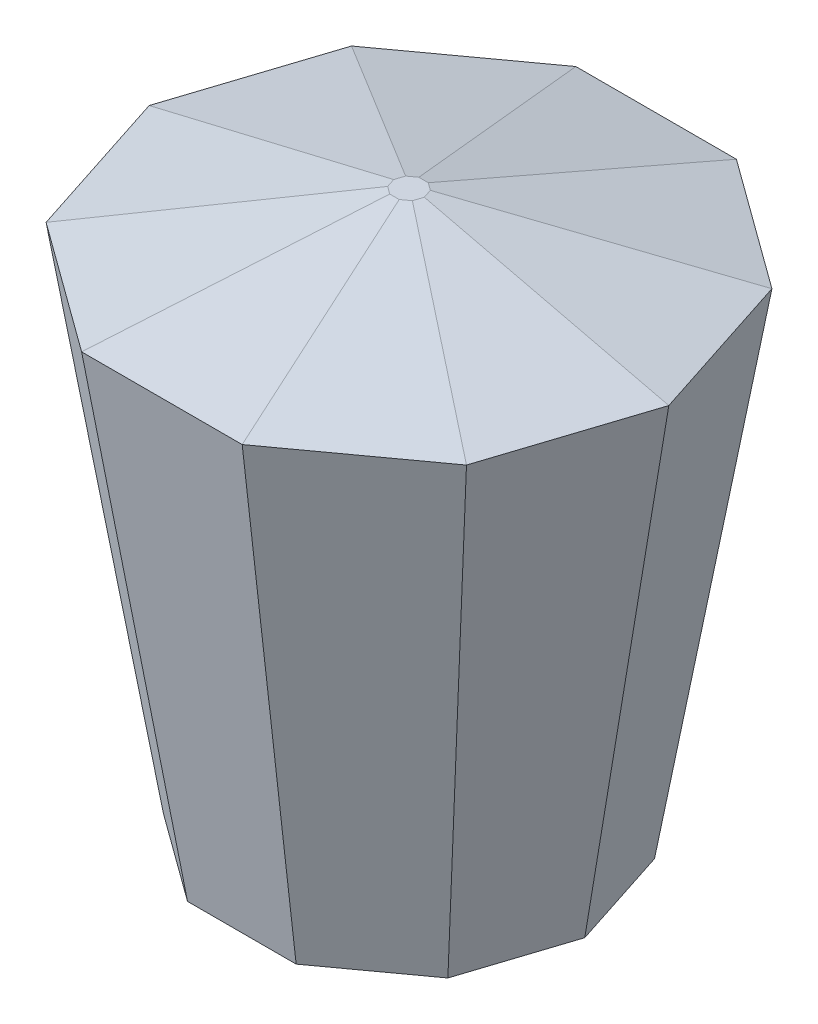
ISO-10303-21;
HEADER;
FILE_DESCRIPTION(('STEP AP214'),'2;1');
FILE_NAME('part.step','',(''),(''),'','','');
FILE_SCHEMA(('AUTOMOTIVE_DESIGN { 1 0 10303 214 1 1 1 1 }'));
ENDSEC;
DATA;
#1=APPLICATION_CONTEXT('core data for automotive mechanical design processes');
#2=APPLICATION_PROTOCOL_DEFINITION('international standard','automotive_design',2000,#1);
#3=PRODUCT_CONTEXT('',#1,'mechanical');
#4=PRODUCT('Part','Part','',(#3));
#5=PRODUCT_RELATED_PRODUCT_CATEGORY('part','',(#4));
#6=PRODUCT_DEFINITION_FORMATION('','',#4);
#7=PRODUCT_DEFINITION_CONTEXT('part definition',#1,'design');
#8=PRODUCT_DEFINITION('design','',#6,#7);
#9=PRODUCT_DEFINITION_SHAPE('','',#8);
#10=(LENGTH_UNIT() NAMED_UNIT(*) SI_UNIT(.MILLI.,.METRE.));
#11=(NAMED_UNIT(*) PLANE_ANGLE_UNIT() SI_UNIT($,.RADIAN.));
#12=(NAMED_UNIT(*) SI_UNIT($,.STERADIAN.) SOLID_ANGLE_UNIT());
#13=UNCERTAINTY_MEASURE_WITH_UNIT(LENGTH_MEASURE(1.E-05),#10,'distance_accuracy_value','');
#14=(GEOMETRIC_REPRESENTATION_CONTEXT(3) GLOBAL_UNCERTAINTY_ASSIGNED_CONTEXT((#13)) GLOBAL_UNIT_ASSIGNED_CONTEXT((#10,
#11,#12)) REPRESENTATION_CONTEXT('',''));
#15=CARTESIAN_POINT('',(0.,0.,0.));
#16=DIRECTION('',(0.,0.,1.));
#17=DIRECTION('',(1.,0.,0.));
#18=AXIS2_PLACEMENT_3D('',#15,#16,#17);
#19=CARTESIAN_POINT('',(0.,0.,0.));
#20=DIRECTION('',(0.,1.,0.));
#21=DIRECTION('',(0.,0.,1.));
#22=AXIS2_PLACEMENT_3D('',#19,#20,#21);
#23=PLANE('',#22);
#24=CARTESIAN_POINT('',(0.,0.,0.));
#25=DIRECTION('',(0.,-1.,0.));
#26=DIRECTION('',(0.,0.,-1.));
#27=AXIS2_PLACEMENT_3D('',#24,#25,#26);
#28=CIRCLE('',#27,1.5);
#29=CARTESIAN_POINT('',(0.,0.,-1.5));
#30=VERTEX_POINT('',#29);
#31=EDGE_CURVE('E374',#30,#30,#28,.T.);
#32=ORIENTED_EDGE('',*,*,#31,.F.);
#33=EDGE_LOOP('',(#32));
#34=FACE_BOUND('',#33,.T.);
#35=DIRECTION('',(-0.309016994374938,0.,0.951056516295157));
#36=VECTOR('',#35,1.);
#37=CARTESIAN_POINT('',(-4.89124214802428,0.,-3.55369543531183));
#38=LINE('',#37,#36);
#39=CARTESIAN_POINT('',(-4.89124214802428,0.,-3.55369543531183));
#40=VERTEX_POINT('',#39);
#41=CARTESIAN_POINT('',(-6.04590778937004,0.,0.));
#42=VERTEX_POINT('',#41);
#43=EDGE_CURVE('E388',#40,#42,#38,.T.);
#44=ORIENTED_EDGE('',*,*,#43,.F.);
#45=DIRECTION('',(-0.80901699437494,0.,0.587785252292483));
#46=VECTOR('',#45,1.);
#47=CARTESIAN_POINT('',(-1.86828825333928,0.,-5.74999999999998));
#48=LINE('',#47,#46);
#49=CARTESIAN_POINT('',(-1.86828825333928,0.,-5.74999999999998));
#50=VERTEX_POINT('',#49);
#51=EDGE_CURVE('E391',#50,#40,#48,.T.);
#52=ORIENTED_EDGE('',*,*,#51,.F.);
#53=DIRECTION('',(-1.,0.,0.));
#54=VECTOR('',#53,1.);
#55=CARTESIAN_POINT('',(1.86828825333916,0.,-5.75000000000002));
#56=LINE('',#55,#54);
#57=CARTESIAN_POINT('',(1.86828825333916,0.,-5.75000000000002));
#58=VERTEX_POINT('',#57);
#59=EDGE_CURVE('E619',#58,#50,#56,.T.);
#60=ORIENTED_EDGE('',*,*,#59,.F.);
#61=DIRECTION('',(-0.809016994374953,0.,-0.587785252292466));
#62=VECTOR('',#61,1.);
#63=CARTESIAN_POINT('',(4.8912421480242,0.,-3.55369543531194));
#64=LINE('',#63,#62);
#65=CARTESIAN_POINT('',(4.8912421480242,0.,-3.55369543531194));
#66=VERTEX_POINT('',#65);
#67=EDGE_CURVE('E587',#66,#58,#64,.T.);
#68=ORIENTED_EDGE('',*,*,#67,.F.);
#69=DIRECTION('',(-0.309016994374954,0.,-0.951056516295151));
#70=VECTOR('',#69,1.);
#71=CARTESIAN_POINT('',(6.04590778937004,0.,0.));
#72=LINE('',#71,#70);
#73=CARTESIAN_POINT('',(6.04590778937004,0.,0.));
#74=VERTEX_POINT('',#73);
#75=EDGE_CURVE('E571',#74,#66,#72,.T.);
#76=ORIENTED_EDGE('',*,*,#75,.F.);
#77=DIRECTION('',(0.309016994374944,0.,-0.951056516295155));
#78=VECTOR('',#77,1.);
#79=CARTESIAN_POINT('',(4.89124214802423,0.,3.55369543531189));
#80=LINE('',#79,#78);
#81=CARTESIAN_POINT('',(4.89124214802423,0.,3.55369543531189));
#82=VERTEX_POINT('',#81);
#83=EDGE_CURVE('E652',#82,#74,#80,.T.);
#84=ORIENTED_EDGE('',*,*,#83,.F.);
#85=DIRECTION('',(0.809016994374947,0.,-0.587785252292473));
#86=VECTOR('',#85,1.);
#87=CARTESIAN_POINT('',(1.86828825333921,0.,5.75));
#88=LINE('',#87,#86);
#89=CARTESIAN_POINT('',(1.86828825333921,0.,5.75));
#90=VERTEX_POINT('',#89);
#91=EDGE_CURVE('E526',#90,#82,#88,.T.);
#92=ORIENTED_EDGE('',*,*,#91,.F.);
#93=DIRECTION('',(1.,0.,0.));
#94=VECTOR('',#93,1.);
#95=CARTESIAN_POINT('',(-1.86828825333917,0.,5.75000000000002));
#96=LINE('',#95,#94);
#97=CARTESIAN_POINT('',(-1.86828825333917,0.,5.75000000000002));
#98=VERTEX_POINT('',#97);
#99=EDGE_CURVE('E508',#98,#90,#96,.T.);
#100=ORIENTED_EDGE('',*,*,#99,.F.);
#101=DIRECTION('',(0.809016994374952,0.,0.587785252292467));
#102=VECTOR('',#101,1.);
#103=CARTESIAN_POINT('',(-4.8912421480242,0.,3.55369543531193));
#104=LINE('',#103,#102);
#105=CARTESIAN_POINT('',(-4.8912421480242,0.,3.55369543531193));
#106=VERTEX_POINT('',#105);
#107=EDGE_CURVE('E672',#106,#98,#104,.T.);
#108=ORIENTED_EDGE('',*,*,#107,.F.);
#109=DIRECTION('',(0.309016994374954,0.,0.951056516295151));
#110=VECTOR('',#109,1.);
#111=CARTESIAN_POINT('',(-6.04590778937004,0.,0.));
#112=LINE('',#111,#110);
#113=EDGE_CURVE('E394',#42,#106,#112,.T.);
#114=ORIENTED_EDGE('',*,*,#113,.F.);
#115=EDGE_LOOP('',(#44,#52,#60,#68,#76,#84,#92,#100,#108,#114));
#116=FACE_BOUND('',#115,.T.);
#117=ADVANCED_FACE('F79',(#34,#116),#23,.F.);
#118=CARTESIAN_POINT('',(-5.33379979756189,-0.891491025818595,1.73305660999099));
#119=DIRECTION('',(0.939263824037324,0.156988507590421,-0.305185316388772));
#120=DIRECTION('',(-0.309016994374954,0.,-0.951056516295152));
#121=AXIS2_PLACEMENT_3D('',#118,#119,#120);
#122=PLANE('',#121);
#123=DIRECTION('',(-0.13336900830551,0.986318120851582,0.0968982564518537));
#124=VECTOR('',#123,1.);
#125=CARTESIAN_POINT('',(-4.8912421480242,0.,3.55369543531193));
#126=LINE('',#125,#124);
#127=CARTESIAN_POINT('',(-7.23053187099231,17.3,5.25328890437415));
#128=VERTEX_POINT('',#127);
#129=EDGE_CURVE('E618',#106,#128,#126,.T.);
#130=ORIENTED_EDGE('',*,*,#129,.T.);
#131=DIRECTION('',(0.309016994374954,0.,0.951056516295152));
#132=VECTOR('',#131,1.);
#133=CARTESIAN_POINT('',(-8.93742890602528,17.3,0.));
#134=LINE('',#133,#132);
#135=CARTESIAN_POINT('',(-8.93742890602528,17.3,0.));
#136=VERTEX_POINT('',#135);
#137=EDGE_CURVE('E326',#136,#128,#134,.T.);
#138=ORIENTED_EDGE('',*,*,#137,.F.);
#139=DIRECTION('',(-0.164853160357345,0.986318120851582,0.));
#140=VECTOR('',#139,1.);
#141=CARTESIAN_POINT('',(-6.04590778937004,0.,0.));
#142=LINE('',#141,#140);
#143=EDGE_CURVE('E465',#42,#136,#142,.T.);
#144=ORIENTED_EDGE('',*,*,#143,.F.);
#145=ORIENTED_EDGE('',*,*,#113,.T.);
#146=EDGE_LOOP('',(#130,#138,#144,#145));
#147=FACE_BOUND('',#146,.T.);
#148=ADVANCED_FACE('F385',(#147),#122,.F.);
#149=CARTESIAN_POINT('',(-5.33379979756192,-0.891491025818595,-1.73305660999092));
#150=DIRECTION('',(0.939263824037328,0.156988507590421,0.30518531638876));
#151=DIRECTION('',(0.309016994374942,0.,-0.951056516295155));
#152=AXIS2_PLACEMENT_3D('',#149,#150,#151);
#153=PLANE('',#152);
#154=ORIENTED_EDGE('',*,*,#143,.T.);
#155=DIRECTION('',(-0.309016994374942,0.,0.951056516295155));
#156=VECTOR('',#155,1.);
#157=CARTESIAN_POINT('',(-7.23053187099238,17.3,-5.25328890437406));
#158=LINE('',#157,#156);
#159=CARTESIAN_POINT('',(-7.23053187099238,17.3,-5.25328890437406));
#160=VERTEX_POINT('',#159);
#161=EDGE_CURVE('E448',#160,#136,#158,.T.);
#162=ORIENTED_EDGE('',*,*,#161,.F.);
#163=DIRECTION('',(-0.133369008305509,0.986318120851582,-0.0968982564518542));
#164=VECTOR('',#163,1.);
#165=CARTESIAN_POINT('',(-4.89124214802428,0.,-3.55369543531183));
#166=LINE('',#165,#164);
#167=EDGE_CURVE('E450',#40,#160,#166,.T.);
#168=ORIENTED_EDGE('',*,*,#167,.F.);
#169=ORIENTED_EDGE('',*,*,#43,.T.);
#170=EDGE_LOOP('',(#154,#162,#168,#169));
#171=FACE_BOUND('',#170,.T.);
#172=ADVANCED_FACE('F467',(#171),#153,.F.);
#173=CARTESIAN_POINT('',(-3.29646956408054,-0.891491025818595,4.537201109384));
#174=DIRECTION('',(0.580496967658263,0.156988507590421,-0.798985531173183));
#175=DIRECTION('',(-0.809016994374951,0.,-0.587785252292468));
#176=AXIS2_PLACEMENT_3D('',#173,#174,#175);
#177=PLANE('',#176);
#178=DIRECTION('',(-0.0509424281268373,0.986318120851582,0.156784672389703));
#179=VECTOR('',#178,1.);
#180=CARTESIAN_POINT('',(-1.86828825333917,0.,5.75000000000002));
#181=LINE('',#180,#179);
#182=CARTESIAN_POINT('',(-2.76181741797965,17.3,8.50000000000002));
#183=VERTEX_POINT('',#182);
#184=EDGE_CURVE('E492',#98,#183,#181,.T.);
#185=ORIENTED_EDGE('',*,*,#184,.T.);
#186=DIRECTION('',(0.809016994374951,0.,0.587785252292468));
#187=VECTOR('',#186,1.);
#188=CARTESIAN_POINT('',(-7.23053187099231,17.3,5.25328890437415));
#189=LINE('',#188,#187);
#190=EDGE_CURVE('E441',#128,#183,#189,.T.);
#191=ORIENTED_EDGE('',*,*,#190,.F.);
#192=ORIENTED_EDGE('',*,*,#129,.F.);
#193=ORIENTED_EDGE('',*,*,#107,.T.);
#194=EDGE_LOOP('',(#185,#191,#192,#193));
#195=FACE_BOUND('',#194,.T.);
#196=ADVANCED_FACE('F476',(#195),#177,.F.);
#197=CARTESIAN_POINT('',(0.,-0.89149102581859,5.60828899878608));
#198=DIRECTION('',(0.,0.156988507590419,-0.987600429568828));
#199=DIRECTION('',(0.,0.987600429568828,0.156988507590419));
#200=AXIS2_PLACEMENT_3D('',#197,#198,#199);
#201=PLANE('',#200);
#202=DIRECTION('',(0.0509424281268424,0.986318120851582,0.156784672389701));
#203=VECTOR('',#202,1.);
#204=CARTESIAN_POINT('',(1.86828825333921,0.,5.75));
#205=LINE('',#204,#203);
#206=CARTESIAN_POINT('',(2.76181741797978,17.3,8.49999999999997));
#207=VERTEX_POINT('',#206);
#208=EDGE_CURVE('E500',#90,#207,#205,.T.);
#209=ORIENTED_EDGE('',*,*,#208,.T.);
#210=DIRECTION('',(1.,0.,0.));
#211=VECTOR('',#210,1.);
#212=CARTESIAN_POINT('',(-2.76181741797965,17.3,8.50000000000002));
#213=LINE('',#212,#211);
#214=EDGE_CURVE('E436',#183,#207,#213,.T.);
#215=ORIENTED_EDGE('',*,*,#214,.F.);
#216=ORIENTED_EDGE('',*,*,#184,.F.);
#217=ORIENTED_EDGE('',*,*,#99,.T.);
#218=EDGE_LOOP('',(#209,#215,#216,#217));
#219=FACE_BOUND('',#218,.T.);
#220=ADVANCED_FACE('F481',(#219),#201,.F.);
#221=CARTESIAN_POINT('',(3.29646956408062,-0.89149102581859,4.53720110938397));
#222=DIRECTION('',(-0.580496967658276,0.15698850759042,-0.798985531173174));
#223=DIRECTION('',(-0.809016994374942,0.,0.587785252292481));
#224=AXIS2_PLACEMENT_3D('',#221,#222,#223);
#225=PLANE('',#224);
#226=DIRECTION('',(0.133369008305513,0.986318120851582,0.0968982564518493));
#227=VECTOR('',#226,1.);
#228=CARTESIAN_POINT('',(4.89124214802423,0.,3.55369543531189));
#229=LINE('',#228,#227);
#230=CARTESIAN_POINT('',(7.23053187099239,17.3,5.25328890437404));
#231=VERTEX_POINT('',#230);
#232=EDGE_CURVE('E519',#82,#231,#229,.T.);
#233=ORIENTED_EDGE('',*,*,#232,.T.);
#234=DIRECTION('',(0.809016994374942,0.,-0.587785252292481));
#235=VECTOR('',#234,1.);
#236=CARTESIAN_POINT('',(2.76181741797978,17.3,8.49999999999997));
#237=LINE('',#236,#235);
#238=EDGE_CURVE('E431',#207,#231,#237,.T.);
#239=ORIENTED_EDGE('',*,*,#238,.F.);
#240=ORIENTED_EDGE('',*,*,#208,.F.);
#241=ORIENTED_EDGE('',*,*,#91,.T.);
#242=EDGE_LOOP('',(#233,#239,#240,#241));
#243=FACE_BOUND('',#242,.T.);
#244=ADVANCED_FACE('F532',(#243),#225,.F.);
#245=CARTESIAN_POINT('',(5.33379979756193,-0.891491025818592,1.7330566099909));
#246=DIRECTION('',(-0.939263824037329,0.15698850759042,-0.305185316388757));
#247=DIRECTION('',(-0.309016994374938,0.,0.951056516295157));
#248=AXIS2_PLACEMENT_3D('',#245,#246,#247);
#249=PLANE('',#248);
#250=DIRECTION('',(0.164853160357344,0.986318120851582,0.));
#251=VECTOR('',#250,1.);
#252=CARTESIAN_POINT('',(6.04590778937004,0.,0.));
#253=LINE('',#252,#251);
#254=CARTESIAN_POINT('',(8.93742890602527,17.3,0.));
#255=VERTEX_POINT('',#254);
#256=EDGE_CURVE('E555',#74,#255,#253,.T.);
#257=ORIENTED_EDGE('',*,*,#256,.T.);
#258=DIRECTION('',(0.309016994374938,0.,-0.951056516295157));
#259=VECTOR('',#258,1.);
#260=CARTESIAN_POINT('',(7.23053187099239,17.3,5.25328890437404));
#261=LINE('',#260,#259);
#262=EDGE_CURVE('E426',#231,#255,#261,.T.);
#263=ORIENTED_EDGE('',*,*,#262,.F.);
#264=ORIENTED_EDGE('',*,*,#232,.F.);
#265=ORIENTED_EDGE('',*,*,#83,.T.);
#266=EDGE_LOOP('',(#257,#263,#264,#265));
#267=FACE_BOUND('',#266,.T.);
#268=ADVANCED_FACE('F541',(#267),#249,.F.);
#269=CARTESIAN_POINT('',(5.33379979756189,-0.891491025818593,-1.733056609991));
#270=DIRECTION('',(-0.939263824037323,0.15698850759042,0.305185316388775));
#271=DIRECTION('',(0.309016994374956,0.,0.951056516295151));
#272=AXIS2_PLACEMENT_3D('',#269,#270,#271);
#273=PLANE('',#272);
#274=DIRECTION('',(0.133369008305509,0.986318120851582,-0.0968982564518548));
#275=VECTOR('',#274,1.);
#276=CARTESIAN_POINT('',(4.8912421480242,0.,-3.55369543531194));
#277=LINE('',#276,#275);
#278=CARTESIAN_POINT('',(7.23053187099229,17.3,-5.25328890437418));
#279=VERTEX_POINT('',#278);
#280=EDGE_CURVE('E563',#66,#279,#277,.T.);
#281=ORIENTED_EDGE('',*,*,#280,.T.);
#282=DIRECTION('',(-0.309016994374956,0.,-0.951056516295151));
#283=VECTOR('',#282,1.);
#284=CARTESIAN_POINT('',(8.93742890602527,17.3,0.));
#285=LINE('',#284,#283);
#286=EDGE_CURVE('E421',#255,#279,#285,.T.);
#287=ORIENTED_EDGE('',*,*,#286,.F.);
#288=ORIENTED_EDGE('',*,*,#256,.F.);
#289=ORIENTED_EDGE('',*,*,#75,.T.);
#290=EDGE_LOOP('',(#281,#287,#288,#289));
#291=FACE_BOUND('',#290,.T.);
#292=ADVANCED_FACE('F545',(#291),#273,.F.);
#293=CARTESIAN_POINT('',(3.29646956408052,-0.891491025818594,-4.53720110938402));
#294=DIRECTION('',(-0.58049696765826,0.15698850759042,0.798985531173185));
#295=DIRECTION('',(0.809016994374953,0.,0.587785252292465));
#296=AXIS2_PLACEMENT_3D('',#293,#294,#295);
#297=PLANE('',#296);
#298=DIRECTION('',(0.0509424281268362,0.986318120851582,-0.156784672389703));
#299=VECTOR('',#298,1.);
#300=CARTESIAN_POINT('',(1.86828825333916,0.,-5.75000000000002));
#301=LINE('',#300,#299);
#302=CARTESIAN_POINT('',(2.76181741797962,17.3,-8.50000000000003));
#303=VERTEX_POINT('',#302);
#304=EDGE_CURVE('E454',#58,#303,#301,.T.);
#305=ORIENTED_EDGE('',*,*,#304,.T.);
#306=DIRECTION('',(-0.809016994374953,0.,-0.587785252292465));
#307=VECTOR('',#306,1.);
#308=CARTESIAN_POINT('',(7.23053187099229,17.3,-5.25328890437418));
#309=LINE('',#308,#307);
#310=EDGE_CURVE('E416',#279,#303,#309,.T.);
#311=ORIENTED_EDGE('',*,*,#310,.F.);
#312=ORIENTED_EDGE('',*,*,#280,.F.);
#313=ORIENTED_EDGE('',*,*,#67,.T.);
#314=EDGE_LOOP('',(#305,#311,#312,#313));
#315=FACE_BOUND('',#314,.T.);
#316=ADVANCED_FACE('F592',(#315),#297,.F.);
#317=CARTESIAN_POINT('',(0.,-0.891491025818594,-5.60828899878606));
#318=DIRECTION('',(0.,0.156988507590421,0.987600429568827));
#319=DIRECTION('',(0.,-0.987600429568827,0.156988507590421));
#320=AXIS2_PLACEMENT_3D('',#317,#318,#319);
#321=PLANE('',#320);
#322=DIRECTION('',(-0.0509424281268397,0.986318120851582,-0.156784672389702));
#323=VECTOR('',#322,1.);
#324=CARTESIAN_POINT('',(-1.86828825333928,0.,-5.74999999999998));
#325=LINE('',#324,#323);
#326=CARTESIAN_POINT('',(-2.7618174179798,17.3,-8.49999999999997));
#327=VERTEX_POINT('',#326);
#328=EDGE_CURVE('E97',#50,#327,#325,.T.);
#329=ORIENTED_EDGE('',*,*,#328,.T.);
#330=DIRECTION('',(-1.,0.,0.));
#331=VECTOR('',#330,1.);
#332=CARTESIAN_POINT('',(2.76181741797962,17.3,-8.50000000000003));
#333=LINE('',#332,#331);
#334=EDGE_CURVE('E89',#303,#327,#333,.T.);
#335=ORIENTED_EDGE('',*,*,#334,.F.);
#336=ORIENTED_EDGE('',*,*,#304,.F.);
#337=ORIENTED_EDGE('',*,*,#59,.T.);
#338=EDGE_LOOP('',(#329,#335,#336,#337));
#339=FACE_BOUND('',#338,.T.);
#340=ADVANCED_FACE('F600',(#339),#321,.F.);
#341=CARTESIAN_POINT('',(-3.2964695640806,-0.891491025818598,-4.53720110938395));
#342=DIRECTION('',(0.580496967658275,0.156988507590421,0.798985531173174));
#343=DIRECTION('',(0.809016994374942,0.,-0.58778525229248));
#344=AXIS2_PLACEMENT_3D('',#341,#342,#343);
#345=PLANE('',#344);
#346=ORIENTED_EDGE('',*,*,#167,.T.);
#347=DIRECTION('',(-0.809016994374942,0.,0.587785252292481));
#348=VECTOR('',#347,1.);
#349=CARTESIAN_POINT('',(-2.7618174179798,17.3,-8.49999999999997));
#350=LINE('',#349,#348);
#351=EDGE_CURVE('E12',#327,#160,#350,.T.);
#352=ORIENTED_EDGE('',*,*,#351,.F.);
#353=ORIENTED_EDGE('',*,*,#328,.F.);
#354=ORIENTED_EDGE('',*,*,#51,.T.);
#355=EDGE_LOOP('',(#346,#352,#353,#354));
#356=FACE_BOUND('',#355,.T.);
#357=ADVANCED_FACE('F81',(#356),#345,.F.);
#358=CARTESIAN_POINT('',(0.,19.3,0.));
#359=DIRECTION('',(0.,1.,0.));
#360=DIRECTION('',(0.,0.,1.));
#361=AXIS2_PLACEMENT_3D('',#358,#359,#360);
#362=PLANE('',#361);
#363=DIRECTION('',(-0.309016994374942,0.,0.951056516295155));
#364=VECTOR('',#363,1.);
#365=CARTESIAN_POINT('',(-0.425325404176022,19.3,-0.309016994374945));
#366=LINE('',#365,#364);
#367=CARTESIAN_POINT('',(-0.425325404176022,19.3,-0.309016994374945));
#368=VERTEX_POINT('',#367);
#369=CARTESIAN_POINT('',(-0.525731112119134,19.3,0.));
#370=VERTEX_POINT('',#369);
#371=EDGE_CURVE('E299',#368,#370,#366,.T.);
#372=ORIENTED_EDGE('',*,*,#371,.T.);
#373=DIRECTION('',(0.309016994374953,0.,0.951056516295152));
#374=VECTOR('',#373,1.);
#375=CARTESIAN_POINT('',(-0.525731112119134,19.3,0.));
#376=LINE('',#375,#374);
#377=CARTESIAN_POINT('',(-0.425325404176018,19.3,0.30901699437495));
#378=VERTEX_POINT('',#377);
#379=EDGE_CURVE('E291',#370,#378,#376,.T.);
#380=ORIENTED_EDGE('',*,*,#379,.T.);
#381=DIRECTION('',(0.809016994374951,0.,0.587785252292468));
#382=VECTOR('',#381,1.);
#383=CARTESIAN_POINT('',(-0.425325404176018,19.3,0.30901699437495));
#384=LINE('',#383,#382);
#385=CARTESIAN_POINT('',(-0.16245984811645,19.3,0.500000000000001));
#386=VERTEX_POINT('',#385);
#387=EDGE_CURVE('E298',#378,#386,#384,.T.);
#388=ORIENTED_EDGE('',*,*,#387,.T.);
#389=DIRECTION('',(1.,0.,0.));
#390=VECTOR('',#389,1.);
#391=CARTESIAN_POINT('',(-0.16245984811645,19.3,0.500000000000001));
#392=LINE('',#391,#390);
#393=CARTESIAN_POINT('',(0.162459848116458,19.3,0.499999999999998));
#394=VERTEX_POINT('',#393);
#395=EDGE_CURVE('E303',#386,#394,#392,.T.);
#396=ORIENTED_EDGE('',*,*,#395,.T.);
#397=DIRECTION('',(0.809016994374942,0.,-0.587785252292481));
#398=VECTOR('',#397,1.);
#399=CARTESIAN_POINT('',(0.162459848116458,19.3,0.499999999999998));
#400=LINE('',#399,#398);
#401=CARTESIAN_POINT('',(0.425325404176023,19.3,0.309016994374943));
#402=VERTEX_POINT('',#401);
#403=EDGE_CURVE('E900',#394,#402,#400,.T.);
#404=ORIENTED_EDGE('',*,*,#403,.T.);
#405=DIRECTION('',(0.309016994374939,0.,-0.951056516295156));
#406=VECTOR('',#405,1.);
#407=CARTESIAN_POINT('',(0.425325404176023,19.3,0.309016994374943));
#408=LINE('',#407,#406);
#409=CARTESIAN_POINT('',(0.525731112119134,19.3,0.));
#410=VERTEX_POINT('',#409);
#411=EDGE_CURVE('E938',#402,#410,#408,.T.);
#412=ORIENTED_EDGE('',*,*,#411,.T.);
#413=DIRECTION('',(-0.309016994374956,0.,-0.951056516295151));
#414=VECTOR('',#413,1.);
#415=CARTESIAN_POINT('',(0.525731112119134,19.3,0.));
#416=LINE('',#415,#414);
#417=CARTESIAN_POINT('',(0.425325404176017,19.3,-0.309016994374952));
#418=VERTEX_POINT('',#417);
#419=EDGE_CURVE('E953',#410,#418,#416,.T.);
#420=ORIENTED_EDGE('',*,*,#419,.T.);
#421=DIRECTION('',(-0.809016994374953,0.,-0.587785252292465));
#422=VECTOR('',#421,1.);
#423=CARTESIAN_POINT('',(0.425325404176017,19.3,-0.309016994374952));
#424=LINE('',#423,#422);
#425=CARTESIAN_POINT('',(0.162459848116448,19.3,-0.500000000000002));
#426=VERTEX_POINT('',#425);
#427=EDGE_CURVE('E217',#418,#426,#424,.T.);
#428=ORIENTED_EDGE('',*,*,#427,.T.);
#429=DIRECTION('',(-1.,0.,0.));
#430=VECTOR('',#429,1.);
#431=CARTESIAN_POINT('',(0.162459848116448,19.3,-0.500000000000002));
#432=LINE('',#431,#430);
#433=CARTESIAN_POINT('',(-0.162459848116459,19.3,-0.499999999999999));
#434=VERTEX_POINT('',#433);
#435=EDGE_CURVE('E193',#426,#434,#432,.T.);
#436=ORIENTED_EDGE('',*,*,#435,.T.);
#437=DIRECTION('',(-0.809016994374942,0.,0.587785252292481));
#438=VECTOR('',#437,1.);
#439=CARTESIAN_POINT('',(-0.162459848116459,19.3,-0.499999999999999));
#440=LINE('',#439,#438);
#441=EDGE_CURVE('E201',#434,#368,#440,.T.);
#442=ORIENTED_EDGE('',*,*,#441,.T.);
#443=EDGE_LOOP('',(#372,#380,#388,#396,#404,#412,#420,#428,#436,#442));
#444=FACE_BOUND('',#443,.T.);
#445=ADVANCED_FACE('F215',(#444),#362,.T.);
#446=CARTESIAN_POINT('',(0.,18.2823529411765,-4.57058823529411));
#447=DIRECTION('',(0.,0.970142500145332,-0.242535625036333));
#448=DIRECTION('',(0.,0.242535625036333,0.970142500145332));
#449=AXIS2_PLACEMENT_3D('',#446,#447,#448);
#450=PLANE('',#449);
#451=DIRECTION('',(0.300636067098667,-0.231315668597677,-0.925262674390713));
#452=VECTOR('',#451,1.);
#453=CARTESIAN_POINT('',(0.162459848116448,19.3,-0.500000000000002));
#454=LINE('',#453,#452);
#455=EDGE_CURVE('E198',#426,#303,#454,.T.);
#456=ORIENTED_EDGE('',*,*,#455,.T.);
#457=ORIENTED_EDGE('',*,*,#334,.T.);
#458=DIRECTION('',(-0.300636067098687,-0.231315668597677,-0.925262674390707));
#459=VECTOR('',#458,1.);
#460=CARTESIAN_POINT('',(-0.162459848116459,19.3,-0.499999999999999));
#461=LINE('',#460,#459);
#462=EDGE_CURVE('E188',#434,#327,#461,.T.);
#463=ORIENTED_EDGE('',*,*,#462,.F.);
#464=ORIENTED_EDGE('',*,*,#435,.F.);
#465=EDGE_LOOP('',(#456,#457,#463,#464));
#466=FACE_BOUND('',#465,.T.);
#467=ADVANCED_FACE('F191',(#466),#450,.T.);
#468=CARTESIAN_POINT('',(-2.68652435900739,18.2823529411765,-3.69768355664311));
#469=DIRECTION('',(-0.142558863551895,0.970142500145332,-0.196215442395742));
#470=DIRECTION('',(0.,0.198240203277189,0.980153468495938));
#471=AXIS2_PLACEMENT_3D('',#468,#469,#470);
#472=PLANE('',#471);
#473=ORIENTED_EDGE('',*,*,#462,.T.);
#474=ORIENTED_EDGE('',*,*,#351,.T.);
#475=DIRECTION('',(-0.787075441908432,-0.231315668597677,-0.571843781295081));
#476=VECTOR('',#475,1.);
#477=CARTESIAN_POINT('',(-0.425325404176022,19.3,-0.309016994374945));
#478=LINE('',#477,#476);
#479=EDGE_CURVE('E205',#368,#160,#478,.T.);
#480=ORIENTED_EDGE('',*,*,#479,.F.);
#481=ORIENTED_EDGE('',*,*,#441,.F.);
#482=EDGE_LOOP('',(#473,#474,#480,#481));
#483=FACE_BOUND('',#482,.T.);
#484=ADVANCED_FACE('F203',(#483),#472,.T.);
#485=CARTESIAN_POINT('',(2.68652435900732,18.2823529411765,-3.69768355664316));
#486=DIRECTION('',(0.142558863551892,0.970142500145332,-0.196215442395745));
#487=DIRECTION('',(0.,0.198240203277192,0.980153468495938));
#488=AXIS2_PLACEMENT_3D('',#485,#486,#487);
#489=PLANE('',#488);
#490=DIRECTION('',(0.787075441908423,-0.231315668597677,-0.571843781295094));
#491=VECTOR('',#490,1.);
#492=CARTESIAN_POINT('',(0.425325404176017,19.3,-0.309016994374952));
#493=LINE('',#492,#491);
#494=EDGE_CURVE('E197',#418,#279,#493,.T.);
#495=ORIENTED_EDGE('',*,*,#494,.T.);
#496=ORIENTED_EDGE('',*,*,#310,.T.);
#497=ORIENTED_EDGE('',*,*,#455,.F.);
#498=ORIENTED_EDGE('',*,*,#427,.F.);
#499=EDGE_LOOP('',(#495,#496,#497,#498));
#500=FACE_BOUND('',#499,.T.);
#501=ADVANCED_FACE('F745',(#500),#489,.T.);
#502=CARTESIAN_POINT('',(4.34688772447842,18.2823529411765,-1.41238943899612));
#503=DIRECTION('',(0.230665086624522,0.970142500145332,-0.074947629877579));
#504=DIRECTION('',(-0.972878749619504,0.231315668597677,0.));
#505=AXIS2_PLACEMENT_3D('',#502,#503,#504);
#506=PLANE('',#505);
#507=DIRECTION('',(0.972878749619504,-0.231315668597677,0.));
#508=VECTOR('',#507,1.);
#509=CARTESIAN_POINT('',(0.525731112119134,19.3,0.));
#510=LINE('',#509,#508);
#511=EDGE_CURVE('E904',#410,#255,#510,.T.);
#512=ORIENTED_EDGE('',*,*,#511,.T.);
#513=ORIENTED_EDGE('',*,*,#286,.T.);
#514=ORIENTED_EDGE('',*,*,#494,.F.);
#515=ORIENTED_EDGE('',*,*,#419,.F.);
#516=EDGE_LOOP('',(#512,#513,#514,#515));
#517=FACE_BOUND('',#516,.T.);
#518=ADVANCED_FACE('F752',(#517),#506,.T.);
#519=CARTESIAN_POINT('',(4.34688772447845,18.2823529411765,1.41238943899604));
#520=DIRECTION('',(0.230665086624523,0.970142500145332,0.0749476298775746));
#521=DIRECTION('',(-0.972878749619504,0.231315668597678,0.));
#522=AXIS2_PLACEMENT_3D('',#519,#520,#521);
#523=PLANE('',#522);
#524=DIRECTION('',(0.787075441908434,-0.231315668597677,0.571843781295078));
#525=VECTOR('',#524,1.);
#526=CARTESIAN_POINT('',(0.425325404176023,19.3,0.309016994374943));
#527=LINE('',#526,#525);
#528=EDGE_CURVE('E902',#402,#231,#527,.T.);
#529=ORIENTED_EDGE('',*,*,#528,.T.);
#530=ORIENTED_EDGE('',*,*,#262,.T.);
#531=ORIENTED_EDGE('',*,*,#511,.F.);
#532=ORIENTED_EDGE('',*,*,#411,.F.);
#533=EDGE_LOOP('',(#529,#530,#531,#532));
#534=FACE_BOUND('',#533,.T.);
#535=ADVANCED_FACE('F761',(#534),#523,.T.);
#536=CARTESIAN_POINT('',(2.6865243590074,18.2823529411765,3.69768355664311));
#537=DIRECTION('',(0.142558863551895,0.970142500145332,0.196215442395742));
#538=DIRECTION('',(0.,-0.198240203277189,0.980153468495938));
#539=AXIS2_PLACEMENT_3D('',#536,#537,#538);
#540=PLANE('',#539);
#541=DIRECTION('',(0.300636067098685,-0.231315668597677,0.925262674390707));
#542=VECTOR('',#541,1.);
#543=CARTESIAN_POINT('',(0.162459848116458,19.3,0.499999999999998));
#544=LINE('',#543,#542);
#545=EDGE_CURVE('E330',#394,#207,#544,.T.);
#546=ORIENTED_EDGE('',*,*,#545,.T.);
#547=ORIENTED_EDGE('',*,*,#238,.T.);
#548=ORIENTED_EDGE('',*,*,#528,.F.);
#549=ORIENTED_EDGE('',*,*,#403,.F.);
#550=EDGE_LOOP('',(#546,#547,#548,#549));
#551=FACE_BOUND('',#550,.T.);
#552=ADVANCED_FACE('F770',(#551),#540,.T.);
#553=CARTESIAN_POINT('',(0.,18.2823529411765,4.57058823529412));
#554=DIRECTION('',(0.,0.970142500145332,0.242535625036333));
#555=DIRECTION('',(0.,-0.242535625036333,0.970142500145332));
#556=AXIS2_PLACEMENT_3D('',#553,#554,#555);
#557=PLANE('',#556);
#558=DIRECTION('',(-0.30063606709867,-0.231315668597677,0.925262674390712));
#559=VECTOR('',#558,1.);
#560=CARTESIAN_POINT('',(-0.16245984811645,19.3,0.500000000000001));
#561=LINE('',#560,#559);
#562=EDGE_CURVE('E317',#386,#183,#561,.T.);
#563=ORIENTED_EDGE('',*,*,#562,.T.);
#564=ORIENTED_EDGE('',*,*,#214,.T.);
#565=ORIENTED_EDGE('',*,*,#545,.F.);
#566=ORIENTED_EDGE('',*,*,#395,.F.);
#567=EDGE_LOOP('',(#563,#564,#565,#566));
#568=FACE_BOUND('',#567,.T.);
#569=ADVANCED_FACE('F779',(#568),#557,.T.);
#570=CARTESIAN_POINT('',(-2.68652435900734,18.2823529411765,3.69768355664315));
#571=DIRECTION('',(-0.142558863551892,0.970142500145332,0.196215442395744));
#572=DIRECTION('',(0.,-0.198240203277191,0.980153468495938));
#573=AXIS2_PLACEMENT_3D('',#570,#571,#572);
#574=PLANE('',#573);
#575=DIRECTION('',(-0.787075441908425,-0.231315668597677,0.571843781295091));
#576=VECTOR('',#575,1.);
#577=CARTESIAN_POINT('',(-0.425325404176018,19.3,0.30901699437495));
#578=LINE('',#577,#576);
#579=EDGE_CURVE('E315',#378,#128,#578,.T.);
#580=ORIENTED_EDGE('',*,*,#579,.T.);
#581=ORIENTED_EDGE('',*,*,#190,.T.);
#582=ORIENTED_EDGE('',*,*,#562,.F.);
#583=ORIENTED_EDGE('',*,*,#387,.F.);
#584=EDGE_LOOP('',(#580,#581,#582,#583));
#585=FACE_BOUND('',#584,.T.);
#586=ADVANCED_FACE('F313',(#585),#574,.T.);
#587=CARTESIAN_POINT('',(-4.34688772447842,18.2823529411765,1.41238943899611));
#588=DIRECTION('',(-0.230665086624522,0.970142500145332,0.0749476298775783));
#589=DIRECTION('',(-0.972878749619504,-0.231315668597677,0.));
#590=AXIS2_PLACEMENT_3D('',#587,#588,#589);
#591=PLANE('',#590);
#592=DIRECTION('',(-0.972878749619504,-0.231315668597677,0.));
#593=VECTOR('',#592,1.);
#594=CARTESIAN_POINT('',(-0.525731112119134,19.3,0.));
#595=LINE('',#594,#593);
#596=EDGE_CURVE('E327',#370,#136,#595,.T.);
#597=ORIENTED_EDGE('',*,*,#596,.T.);
#598=ORIENTED_EDGE('',*,*,#137,.T.);
#599=ORIENTED_EDGE('',*,*,#579,.F.);
#600=ORIENTED_EDGE('',*,*,#379,.F.);
#601=EDGE_LOOP('',(#597,#598,#599,#600));
#602=FACE_BOUND('',#601,.T.);
#603=ADVANCED_FACE('F323',(#602),#591,.T.);
#604=CARTESIAN_POINT('',(-4.34688772447844,18.2823529411765,-1.41238943899605));
#605=DIRECTION('',(-0.230665086624523,0.970142500145332,-0.0749476298775753));
#606=DIRECTION('',(-0.972878749619504,-0.231315668597678,0.));
#607=AXIS2_PLACEMENT_3D('',#604,#605,#606);
#608=PLANE('',#607);
#609=ORIENTED_EDGE('',*,*,#479,.T.);
#610=ORIENTED_EDGE('',*,*,#161,.T.);
#611=ORIENTED_EDGE('',*,*,#596,.F.);
#612=ORIENTED_EDGE('',*,*,#371,.F.);
#613=EDGE_LOOP('',(#609,#610,#611,#612));
#614=FACE_BOUND('',#613,.T.);
#615=ADVANCED_FACE('F350',(#614),#608,.T.);
#616=CARTESIAN_POINT('',(0.,18.,0.));
#617=DIRECTION('',(0.,-1.,0.));
#618=DIRECTION('',(0.,0.,-1.));
#619=AXIS2_PLACEMENT_3D('',#616,#617,#618);
#620=CYLINDRICAL_SURFACE('',#619,1.5);
#621=CARTESIAN_POINT('',(0.,18.,0.));
#622=DIRECTION('',(0.,-1.,0.));
#623=DIRECTION('',(0.,0.,-1.));
#624=AXIS2_PLACEMENT_3D('',#621,#622,#623);
#625=CIRCLE('',#624,1.5);
#626=CARTESIAN_POINT('',(0.,18.,-1.5));
#627=VERTEX_POINT('',#626);
#628=EDGE_CURVE('E372',#627,#627,#625,.T.);
#629=ORIENTED_EDGE('',*,*,#628,.F.);
#630=EDGE_LOOP('',(#629));
#631=FACE_BOUND('',#630,.T.);
#632=ORIENTED_EDGE('',*,*,#31,.T.);
#633=EDGE_LOOP('',(#632));
#634=FACE_BOUND('',#633,.T.);
#635=ADVANCED_FACE('F237',(#631,#634),#620,.F.);
#636=CARTESIAN_POINT('',(0.,18.,0.));
#637=DIRECTION('',(0.,-1.,0.));
#638=DIRECTION('',(0.,0.,-1.));
#639=AXIS2_PLACEMENT_3D('',#636,#637,#638);
#640=PLANE('',#639);
#641=ORIENTED_EDGE('',*,*,#628,.T.);
#642=EDGE_LOOP('',(#641));
#643=FACE_BOUND('',#642,.T.);
#644=ADVANCED_FACE('F817',(#643),#640,.T.);
#645=CLOSED_SHELL('',(#117,#148,#172,#196,#220,#244,#268,#292,#316,#340,#357,#445,#467,#484,
#501,#518,#535,#552,#569,#586,#603,#615,#635,#644));
#646=MANIFOLD_SOLID_BREP('B2',#645);
#647=ADVANCED_BREP_SHAPE_REPRESENTATION('',(#18,#646),#14);
#648=SHAPE_DEFINITION_REPRESENTATION(#9,#647);
ENDSEC;
END-ISO-10303-21;
